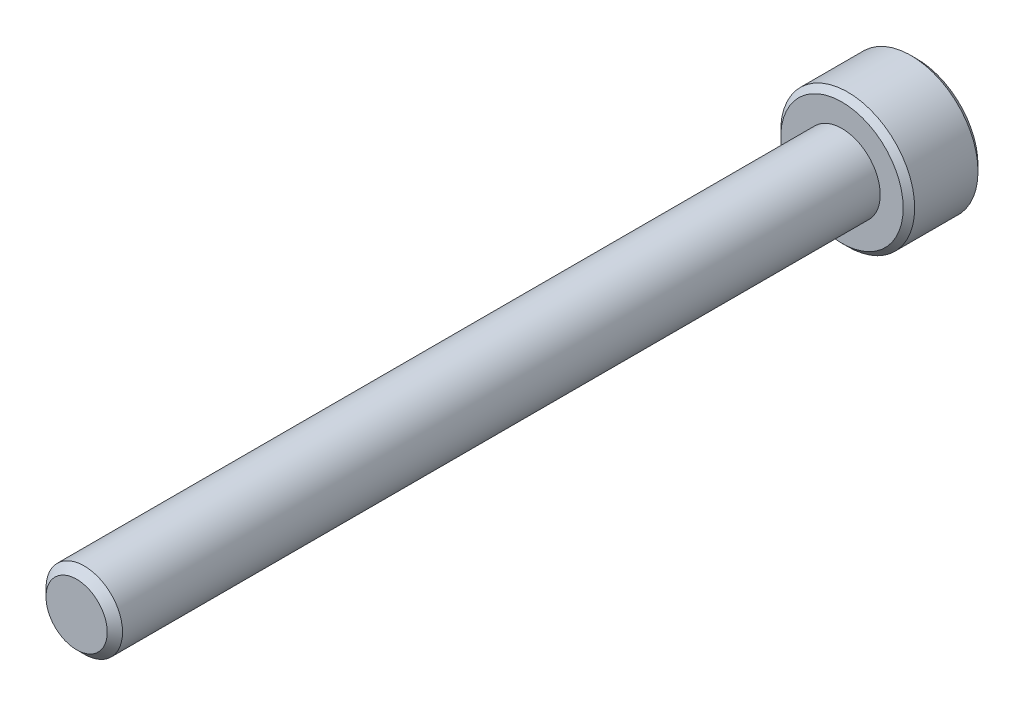
ISO-10303-21;
HEADER;
FILE_DESCRIPTION(('STEP AP214'),'2;1');
FILE_NAME('part.step','',(''),(''),'','','');
FILE_SCHEMA(('AUTOMOTIVE_DESIGN { 1 0 10303 214 1 1 1 1 }'));
ENDSEC;
DATA;
#1=APPLICATION_CONTEXT('core data for automotive mechanical design processes');
#2=APPLICATION_PROTOCOL_DEFINITION('international standard','automotive_design',2000,#1);
#3=PRODUCT_CONTEXT('',#1,'mechanical');
#4=PRODUCT('Part','Part','',(#3));
#5=PRODUCT_RELATED_PRODUCT_CATEGORY('part','',(#4));
#6=PRODUCT_DEFINITION_FORMATION('','',#4);
#7=PRODUCT_DEFINITION_CONTEXT('part definition',#1,'design');
#8=PRODUCT_DEFINITION('design','',#6,#7);
#9=PRODUCT_DEFINITION_SHAPE('','',#8);
#10=(LENGTH_UNIT() NAMED_UNIT(*) SI_UNIT(.MILLI.,.METRE.));
#11=(NAMED_UNIT(*) PLANE_ANGLE_UNIT() SI_UNIT($,.RADIAN.));
#12=(NAMED_UNIT(*) SI_UNIT($,.STERADIAN.) SOLID_ANGLE_UNIT());
#13=UNCERTAINTY_MEASURE_WITH_UNIT(LENGTH_MEASURE(1.E-05),#10,'distance_accuracy_value','');
#14=(GEOMETRIC_REPRESENTATION_CONTEXT(3) GLOBAL_UNCERTAINTY_ASSIGNED_CONTEXT((#13)) GLOBAL_UNIT_ASSIGNED_CONTEXT((#10,
#11,#12)) REPRESENTATION_CONTEXT('',''));
#15=CARTESIAN_POINT('',(0.,0.,0.));
#16=DIRECTION('',(0.,0.,1.));
#17=DIRECTION('',(1.,0.,0.));
#18=AXIS2_PLACEMENT_3D('',#15,#16,#17);
#19=CARTESIAN_POINT('',(0.,0.,3.91));
#20=DIRECTION('',(0.,0.,-1.));
#21=DIRECTION('',(-1.,0.,0.));
#22=AXIS2_PLACEMENT_3D('',#19,#20,#21);
#23=CYLINDRICAL_SURFACE('',#22,3.5);
#24=CARTESIAN_POINT('',(0.,0.,3.60999999999999));
#25=DIRECTION('',(0.,0.,1.));
#26=DIRECTION('',(1.,0.,0.));
#27=AXIS2_PLACEMENT_3D('',#24,#25,#26);
#28=CIRCLE('',#27,3.5);
#29=CARTESIAN_POINT('',(3.5,0.,3.60999999999999));
#30=VERTEX_POINT('',#29);
#31=EDGE_CURVE('E51',#30,#30,#28,.F.);
#32=ORIENTED_EDGE('',*,*,#31,.T.);
#33=EDGE_LOOP('',(#32));
#34=FACE_BOUND('',#33,.T.);
#35=CARTESIAN_POINT('',(0.,0.,0.300000000000001));
#36=DIRECTION('',(0.,0.,1.));
#37=DIRECTION('',(1.,0.,0.));
#38=AXIS2_PLACEMENT_3D('',#35,#36,#37);
#39=CIRCLE('',#38,3.5);
#40=CARTESIAN_POINT('',(3.5,0.,0.300000000000001));
#41=VERTEX_POINT('',#40);
#42=EDGE_CURVE('E182',#41,#41,#39,.T.);
#43=ORIENTED_EDGE('',*,*,#42,.T.);
#44=EDGE_LOOP('',(#43));
#45=FACE_BOUND('',#44,.T.);
#46=ADVANCED_FACE('F41',(#34,#45),#23,.T.);
#47=CARTESIAN_POINT('',(0.,0.,3.91));
#48=DIRECTION('',(0.,0.,1.));
#49=DIRECTION('',(1.,0.,0.));
#50=AXIS2_PLACEMENT_3D('',#47,#48,#49);
#51=PLANE('',#50);
#52=CARTESIAN_POINT('',(0.,0.,3.91));
#53=DIRECTION('',(0.,0.,1.));
#54=DIRECTION('',(1.,0.,0.));
#55=AXIS2_PLACEMENT_3D('',#52,#53,#54);
#56=CIRCLE('',#55,3.19999999999999);
#57=CARTESIAN_POINT('',(3.19999999999999,0.,3.91));
#58=VERTEX_POINT('',#57);
#59=EDGE_CURVE('E178',#58,#58,#56,.T.);
#60=ORIENTED_EDGE('',*,*,#59,.T.);
#61=EDGE_LOOP('',(#60));
#62=FACE_BOUND('',#61,.T.);
#63=CARTESIAN_POINT('',(0.,0.,3.91));
#64=DIRECTION('',(0.,0.,1.));
#65=DIRECTION('',(1.,0.,0.));
#66=AXIS2_PLACEMENT_3D('',#63,#64,#65);
#67=CIRCLE('',#66,2.);
#68=CARTESIAN_POINT('',(2.,0.,3.91));
#69=VERTEX_POINT('',#68);
#70=EDGE_CURVE('E157',#69,#69,#67,.T.);
#71=ORIENTED_EDGE('',*,*,#70,.F.);
#72=EDGE_LOOP('',(#71));
#73=FACE_BOUND('',#72,.T.);
#74=ADVANCED_FACE('F197',(#62,#73),#51,.T.);
#75=CARTESIAN_POINT('',(0.,0.,0.));
#76=DIRECTION('',(0.,0.,1.));
#77=DIRECTION('',(1.,0.,0.));
#78=AXIS2_PLACEMENT_3D('',#75,#76,#77);
#79=PLANE('',#78);
#80=CARTESIAN_POINT('',(0.,0.,0.));
#81=DIRECTION('',(0.,0.,1.));
#82=DIRECTION('',(1.,0.,0.));
#83=AXIS2_PLACEMENT_3D('',#80,#81,#82);
#84=CIRCLE('',#83,3.2);
#85=CARTESIAN_POINT('',(3.2,0.,0.));
#86=VERTEX_POINT('',#85);
#87=EDGE_CURVE('E11',#86,#86,#84,.F.);
#88=ORIENTED_EDGE('',*,*,#87,.T.);
#89=EDGE_LOOP('',(#88));
#90=FACE_BOUND('',#89,.T.);
#91=DIRECTION('',(0.866025403784439,-0.5,0.));
#92=VECTOR('',#91,1.);
#93=CARTESIAN_POINT('',(0.,1.76091832102836,0.));
#94=LINE('',#93,#92);
#95=CARTESIAN_POINT('',(0.,1.76091832102836,0.));
#96=VERTEX_POINT('',#95);
#97=CARTESIAN_POINT('',(1.525,0.88045916051418,0.));
#98=VERTEX_POINT('',#97);
#99=EDGE_CURVE('E138',#96,#98,#94,.T.);
#100=ORIENTED_EDGE('',*,*,#99,.F.);
#101=DIRECTION('',(0.866025403784439,0.5,0.));
#102=VECTOR('',#101,1.);
#103=CARTESIAN_POINT('',(-1.525,0.880459160514179,0.));
#104=LINE('',#103,#102);
#105=CARTESIAN_POINT('',(-1.525,0.880459160514179,0.));
#106=VERTEX_POINT('',#105);
#107=EDGE_CURVE('E58',#106,#96,#104,.T.);
#108=ORIENTED_EDGE('',*,*,#107,.F.);
#109=DIRECTION('',(0.,1.,0.));
#110=VECTOR('',#109,1.);
#111=CARTESIAN_POINT('',(-1.525,-0.88045916051418,0.));
#112=LINE('',#111,#110);
#113=CARTESIAN_POINT('',(-1.525,-0.88045916051418,0.));
#114=VERTEX_POINT('',#113);
#115=EDGE_CURVE('E151',#114,#106,#112,.T.);
#116=ORIENTED_EDGE('',*,*,#115,.F.);
#117=DIRECTION('',(-0.866025403784439,0.5,0.));
#118=VECTOR('',#117,1.);
#119=CARTESIAN_POINT('',(0.,-1.76091832102836,0.));
#120=LINE('',#119,#118);
#121=CARTESIAN_POINT('',(0.,-1.76091832102836,0.));
#122=VERTEX_POINT('',#121);
#123=EDGE_CURVE('E148',#122,#114,#120,.T.);
#124=ORIENTED_EDGE('',*,*,#123,.F.);
#125=DIRECTION('',(-0.866025403784438,-0.5,0.));
#126=VECTOR('',#125,1.);
#127=CARTESIAN_POINT('',(1.525,-0.880459160514179,0.));
#128=LINE('',#127,#126);
#129=CARTESIAN_POINT('',(1.525,-0.880459160514179,0.));
#130=VERTEX_POINT('',#129);
#131=EDGE_CURVE('E106',#130,#122,#128,.T.);
#132=ORIENTED_EDGE('',*,*,#131,.F.);
#133=DIRECTION('',(0.,-1.,0.));
#134=VECTOR('',#133,1.);
#135=CARTESIAN_POINT('',(1.525,0.88045916051418,0.));
#136=LINE('',#135,#134);
#137=EDGE_CURVE('E142',#98,#130,#136,.T.);
#138=ORIENTED_EDGE('',*,*,#137,.F.);
#139=EDGE_LOOP('',(#100,#108,#116,#124,#132,#138));
#140=FACE_BOUND('',#139,.T.);
#141=ADVANCED_FACE('F200',(#90,#140),#79,.F.);
#142=CARTESIAN_POINT('',(0.,0.,43.91));
#143=DIRECTION('',(0.,0.,-1.));
#144=DIRECTION('',(-1.,0.,0.));
#145=AXIS2_PLACEMENT_3D('',#142,#143,#144);
#146=CYLINDRICAL_SURFACE('',#145,2.);
#147=CARTESIAN_POINT('',(0.,0.,43.51));
#148=DIRECTION('',(0.,0.,1.));
#149=DIRECTION('',(1.,0.,0.));
#150=AXIS2_PLACEMENT_3D('',#147,#148,#149);
#151=CIRCLE('',#150,2.);
#152=CARTESIAN_POINT('',(2.,0.,43.51));
#153=VERTEX_POINT('',#152);
#154=EDGE_CURVE('E174',#153,#153,#151,.F.);
#155=ORIENTED_EDGE('',*,*,#154,.T.);
#156=EDGE_LOOP('',(#155));
#157=FACE_BOUND('',#156,.T.);
#158=ORIENTED_EDGE('',*,*,#70,.T.);
#159=EDGE_LOOP('',(#158));
#160=FACE_BOUND('',#159,.T.);
#161=ADVANCED_FACE('F204',(#157,#160),#146,.T.);
#162=CARTESIAN_POINT('',(0.,0.,43.91));
#163=DIRECTION('',(0.,0.,1.));
#164=DIRECTION('',(1.,0.,0.));
#165=AXIS2_PLACEMENT_3D('',#162,#163,#164);
#166=PLANE('',#165);
#167=CARTESIAN_POINT('',(0.,0.,43.91));
#168=DIRECTION('',(0.,0.,1.));
#169=DIRECTION('',(1.,0.,0.));
#170=AXIS2_PLACEMENT_3D('',#167,#168,#169);
#171=CIRCLE('',#170,1.6);
#172=CARTESIAN_POINT('',(1.6,0.,43.91));
#173=VERTEX_POINT('',#172);
#174=EDGE_CURVE('E170',#173,#173,#171,.T.);
#175=ORIENTED_EDGE('',*,*,#174,.T.);
#176=EDGE_LOOP('',(#175));
#177=FACE_BOUND('',#176,.T.);
#178=ADVANCED_FACE('F206',(#177),#166,.T.);
#179=CARTESIAN_POINT('',(-1.525,0.880459160514179,2.));
#180=DIRECTION('',(-0.5,0.866025403784439,0.));
#181=DIRECTION('',(-0.866025403784439,-0.5,0.));
#182=AXIS2_PLACEMENT_3D('',#179,#180,#181);
#183=PLANE('',#182);
#184=ORIENTED_EDGE('',*,*,#107,.T.);
#185=DIRECTION('',(0.,0.,-1.));
#186=VECTOR('',#185,1.);
#187=CARTESIAN_POINT('',(0.,1.76091832102836,2.));
#188=LINE('',#187,#186);
#189=CARTESIAN_POINT('',(0.,1.76091832102836,2.));
#190=VERTEX_POINT('',#189);
#191=EDGE_CURVE('E88',#190,#96,#188,.T.);
#192=ORIENTED_EDGE('',*,*,#191,.F.);
#193=DIRECTION('',(0.866025403784439,0.5,0.));
#194=VECTOR('',#193,1.);
#195=CARTESIAN_POINT('',(-1.525,0.880459160514179,2.));
#196=LINE('',#195,#194);
#197=CARTESIAN_POINT('',(-1.525,0.880459160514179,2.));
#198=VERTEX_POINT('',#197);
#199=EDGE_CURVE('E154',#198,#190,#196,.T.);
#200=ORIENTED_EDGE('',*,*,#199,.F.);
#201=DIRECTION('',(0.,0.,-1.));
#202=VECTOR('',#201,1.);
#203=CARTESIAN_POINT('',(-1.525,0.880459160514179,2.));
#204=LINE('',#203,#202);
#205=EDGE_CURVE('E66',#198,#106,#204,.T.);
#206=ORIENTED_EDGE('',*,*,#205,.T.);
#207=EDGE_LOOP('',(#184,#192,#200,#206));
#208=FACE_BOUND('',#207,.T.);
#209=ADVANCED_FACE('F213',(#208),#183,.F.);
#210=CARTESIAN_POINT('',(-1.525,-0.88045916051418,2.));
#211=DIRECTION('',(-1.,0.,0.));
#212=DIRECTION('',(0.,0.,1.));
#213=AXIS2_PLACEMENT_3D('',#210,#211,#212);
#214=PLANE('',#213);
#215=ORIENTED_EDGE('',*,*,#115,.T.);
#216=ORIENTED_EDGE('',*,*,#205,.F.);
#217=DIRECTION('',(0.,1.,0.));
#218=VECTOR('',#217,1.);
#219=CARTESIAN_POINT('',(-1.525,-0.88045916051418,2.));
#220=LINE('',#219,#218);
#221=CARTESIAN_POINT('',(-1.525,-0.88045916051418,2.));
#222=VERTEX_POINT('',#221);
#223=EDGE_CURVE('E120',#222,#198,#220,.T.);
#224=ORIENTED_EDGE('',*,*,#223,.F.);
#225=DIRECTION('',(0.,0.,-1.));
#226=VECTOR('',#225,1.);
#227=CARTESIAN_POINT('',(-1.525,-0.88045916051418,2.));
#228=LINE('',#227,#226);
#229=EDGE_CURVE('E111',#222,#114,#228,.T.);
#230=ORIENTED_EDGE('',*,*,#229,.T.);
#231=EDGE_LOOP('',(#215,#216,#224,#230));
#232=FACE_BOUND('',#231,.T.);
#233=ADVANCED_FACE('F248',(#232),#214,.F.);
#234=CARTESIAN_POINT('',(0.,-1.76091832102836,2.));
#235=DIRECTION('',(-0.5,-0.866025403784439,0.));
#236=DIRECTION('',(0.866025403784439,-0.5,0.));
#237=AXIS2_PLACEMENT_3D('',#234,#235,#236);
#238=PLANE('',#237);
#239=ORIENTED_EDGE('',*,*,#123,.T.);
#240=ORIENTED_EDGE('',*,*,#229,.F.);
#241=DIRECTION('',(-0.866025403784439,0.5,0.));
#242=VECTOR('',#241,1.);
#243=CARTESIAN_POINT('',(0.,-1.76091832102836,2.));
#244=LINE('',#243,#242);
#245=CARTESIAN_POINT('',(0.,-1.76091832102836,2.));
#246=VERTEX_POINT('',#245);
#247=EDGE_CURVE('E115',#246,#222,#244,.T.);
#248=ORIENTED_EDGE('',*,*,#247,.F.);
#249=DIRECTION('',(0.,0.,-1.));
#250=VECTOR('',#249,1.);
#251=CARTESIAN_POINT('',(0.,-1.76091832102836,2.));
#252=LINE('',#251,#250);
#253=EDGE_CURVE('E99',#246,#122,#252,.T.);
#254=ORIENTED_EDGE('',*,*,#253,.T.);
#255=EDGE_LOOP('',(#239,#240,#248,#254));
#256=FACE_BOUND('',#255,.T.);
#257=ADVANCED_FACE('F116',(#256),#238,.F.);
#258=CARTESIAN_POINT('',(1.525,-0.880459160514179,2.));
#259=DIRECTION('',(0.5,-0.866025403784439,0.));
#260=DIRECTION('',(0.866025403784438,0.5,0.));
#261=AXIS2_PLACEMENT_3D('',#258,#259,#260);
#262=PLANE('',#261);
#263=ORIENTED_EDGE('',*,*,#131,.T.);
#264=ORIENTED_EDGE('',*,*,#253,.F.);
#265=DIRECTION('',(-0.866025403784438,-0.5,0.));
#266=VECTOR('',#265,1.);
#267=CARTESIAN_POINT('',(1.525,-0.880459160514179,2.));
#268=LINE('',#267,#266);
#269=CARTESIAN_POINT('',(1.525,-0.880459160514179,2.));
#270=VERTEX_POINT('',#269);
#271=EDGE_CURVE('E103',#270,#246,#268,.T.);
#272=ORIENTED_EDGE('',*,*,#271,.F.);
#273=DIRECTION('',(0.,0.,-1.));
#274=VECTOR('',#273,1.);
#275=CARTESIAN_POINT('',(1.525,-0.880459160514179,2.));
#276=LINE('',#275,#274);
#277=EDGE_CURVE('E112',#270,#130,#276,.T.);
#278=ORIENTED_EDGE('',*,*,#277,.T.);
#279=EDGE_LOOP('',(#263,#264,#272,#278));
#280=FACE_BOUND('',#279,.T.);
#281=ADVANCED_FACE('F101',(#280),#262,.F.);
#282=CARTESIAN_POINT('',(1.525,0.88045916051418,2.));
#283=DIRECTION('',(1.,0.,0.));
#284=DIRECTION('',(0.,0.,-1.));
#285=AXIS2_PLACEMENT_3D('',#282,#283,#284);
#286=PLANE('',#285);
#287=ORIENTED_EDGE('',*,*,#137,.T.);
#288=ORIENTED_EDGE('',*,*,#277,.F.);
#289=DIRECTION('',(0.,-1.,0.));
#290=VECTOR('',#289,1.);
#291=CARTESIAN_POINT('',(1.525,0.88045916051418,2.));
#292=LINE('',#291,#290);
#293=CARTESIAN_POINT('',(1.525,0.88045916051418,2.));
#294=VERTEX_POINT('',#293);
#295=EDGE_CURVE('E126',#294,#270,#292,.T.);
#296=ORIENTED_EDGE('',*,*,#295,.F.);
#297=DIRECTION('',(0.,0.,-1.));
#298=VECTOR('',#297,1.);
#299=CARTESIAN_POINT('',(1.525,0.88045916051418,2.));
#300=LINE('',#299,#298);
#301=EDGE_CURVE('E162',#294,#98,#300,.T.);
#302=ORIENTED_EDGE('',*,*,#301,.T.);
#303=EDGE_LOOP('',(#287,#288,#296,#302));
#304=FACE_BOUND('',#303,.T.);
#305=ADVANCED_FACE('F244',(#304),#286,.F.);
#306=CARTESIAN_POINT('',(0.,1.76091832102836,2.));
#307=DIRECTION('',(0.5,0.866025403784439,0.));
#308=DIRECTION('',(-0.866025403784439,0.5,0.));
#309=AXIS2_PLACEMENT_3D('',#306,#307,#308);
#310=PLANE('',#309);
#311=ORIENTED_EDGE('',*,*,#99,.T.);
#312=ORIENTED_EDGE('',*,*,#301,.F.);
#313=DIRECTION('',(0.866025403784439,-0.5,0.));
#314=VECTOR('',#313,1.);
#315=CARTESIAN_POINT('',(0.,1.76091832102836,2.));
#316=LINE('',#315,#314);
#317=EDGE_CURVE('E130',#190,#294,#316,.T.);
#318=ORIENTED_EDGE('',*,*,#317,.F.);
#319=ORIENTED_EDGE('',*,*,#191,.T.);
#320=EDGE_LOOP('',(#311,#312,#318,#319));
#321=FACE_BOUND('',#320,.T.);
#322=ADVANCED_FACE('F236',(#321),#310,.F.);
#323=CARTESIAN_POINT('',(0.,0.,2.));
#324=DIRECTION('',(0.,0.,-1.));
#325=DIRECTION('',(-1.,0.,0.));
#326=AXIS2_PLACEMENT_3D('',#323,#324,#325);
#327=PLANE('',#326);
#328=ORIENTED_EDGE('',*,*,#199,.T.);
#329=ORIENTED_EDGE('',*,*,#317,.T.);
#330=ORIENTED_EDGE('',*,*,#295,.T.);
#331=ORIENTED_EDGE('',*,*,#271,.T.);
#332=ORIENTED_EDGE('',*,*,#247,.T.);
#333=ORIENTED_EDGE('',*,*,#223,.T.);
#334=EDGE_LOOP('',(#328,#329,#330,#331,#332,#333));
#335=FACE_BOUND('',#334,.T.);
#336=ADVANCED_FACE('F123',(#335),#327,.T.);
#337=CARTESIAN_POINT('',(0.,0.,43.91));
#338=DIRECTION('',(0.,0.,-1.));
#339=DIRECTION('',(-1.,0.,0.));
#340=AXIS2_PLACEMENT_3D('',#337,#338,#339);
#341=CONICAL_SURFACE('',#340,1.6,0.785398163397438);
#342=ORIENTED_EDGE('',*,*,#154,.F.);
#343=EDGE_LOOP('',(#342));
#344=FACE_BOUND('',#343,.T.);
#345=ORIENTED_EDGE('',*,*,#174,.F.);
#346=EDGE_LOOP('',(#345));
#347=FACE_BOUND('',#346,.T.);
#348=ADVANCED_FACE('F194',(#344,#347),#341,.T.);
#349=CARTESIAN_POINT('',(0.,0.,3.91));
#350=DIRECTION('',(0.,0.,-1.));
#351=DIRECTION('',(-1.,0.,0.));
#352=AXIS2_PLACEMENT_3D('',#349,#350,#351);
#353=CONICAL_SURFACE('',#352,3.19999999999999,0.785398163397447);
#354=ORIENTED_EDGE('',*,*,#31,.F.);
#355=EDGE_LOOP('',(#354));
#356=FACE_BOUND('',#355,.T.);
#357=ORIENTED_EDGE('',*,*,#59,.F.);
#358=EDGE_LOOP('',(#357));
#359=FACE_BOUND('',#358,.T.);
#360=ADVANCED_FACE('F191',(#356,#359),#353,.T.);
#361=CARTESIAN_POINT('',(0.,0.,0.300000000000001));
#362=DIRECTION('',(0.,0.,1.));
#363=DIRECTION('',(1.,0.,0.));
#364=AXIS2_PLACEMENT_3D('',#361,#362,#363);
#365=CONICAL_SURFACE('',#364,3.5,0.785398163397451);
#366=CARTESIAN_POINT('',(3.2,0.,0.));
#367=CARTESIAN_POINT('',(3.203125,0.,0.00312500000000003));
#368=CARTESIAN_POINT('',(3.20625,0.,0.00625000000000004));
#369=CARTESIAN_POINT('',(3.2125,0.,0.0125));
#370=CARTESIAN_POINT('',(3.215625,0.,0.015625));
#371=CARTESIAN_POINT('',(3.221875,0.,0.021875));
#372=CARTESIAN_POINT('',(3.225,0.,0.025));
#373=CARTESIAN_POINT('',(3.23125,0.,0.03125));
#374=CARTESIAN_POINT('',(3.234375,0.,0.0343750000000001));
#375=CARTESIAN_POINT('',(3.240625,0.,0.0406250000000001));
#376=CARTESIAN_POINT('',(3.24375,0.,0.04375));
#377=CARTESIAN_POINT('',(3.25,0.,0.0500000000000001));
#378=CARTESIAN_POINT('',(3.253125,0.,0.0531250000000001));
#379=CARTESIAN_POINT('',(3.259375,0.,0.0593750000000001));
#380=CARTESIAN_POINT('',(3.2625,0.,0.0625000000000001));
#381=CARTESIAN_POINT('',(3.26875,0.,0.0687500000000001));
#382=CARTESIAN_POINT('',(3.271875,0.,0.0718750000000001));
#383=CARTESIAN_POINT('',(3.278125,0.,0.0781250000000002));
#384=CARTESIAN_POINT('',(3.28125,0.,0.0812500000000002));
#385=CARTESIAN_POINT('',(3.2875,0.,0.0875000000000001));
#386=CARTESIAN_POINT('',(3.290625,0.,0.0906250000000001));
#387=CARTESIAN_POINT('',(3.296875,0.,0.0968750000000002));
#388=CARTESIAN_POINT('',(3.3,0.,0.1));
#389=CARTESIAN_POINT('',(3.30625,0.,0.10625));
#390=CARTESIAN_POINT('',(3.309375,0.,0.109375));
#391=CARTESIAN_POINT('',(3.315625,0.,0.115625));
#392=CARTESIAN_POINT('',(3.31875,0.,0.11875));
#393=CARTESIAN_POINT('',(3.325,0.,0.125));
#394=CARTESIAN_POINT('',(3.328125,0.,0.128125));
#395=CARTESIAN_POINT('',(3.334375,0.,0.134375));
#396=CARTESIAN_POINT('',(3.3375,0.,0.1375));
#397=CARTESIAN_POINT('',(3.34375,0.,0.14375));
#398=CARTESIAN_POINT('',(3.346875,0.,0.146875));
#399=CARTESIAN_POINT('',(3.353125,0.,0.153125));
#400=CARTESIAN_POINT('',(3.35625,0.,0.15625));
#401=CARTESIAN_POINT('',(3.3625,0.,0.1625));
#402=CARTESIAN_POINT('',(3.365625,0.,0.165625));
#403=CARTESIAN_POINT('',(3.371875,0.,0.171875));
#404=CARTESIAN_POINT('',(3.375,0.,0.175));
#405=CARTESIAN_POINT('',(3.38125,0.,0.18125));
#406=CARTESIAN_POINT('',(3.384375,0.,0.184375));
#407=CARTESIAN_POINT('',(3.390625,0.,0.190625));
#408=CARTESIAN_POINT('',(3.39375,0.,0.19375));
#409=CARTESIAN_POINT('',(3.4,0.,0.2));
#410=CARTESIAN_POINT('',(3.403125,0.,0.203125));
#411=CARTESIAN_POINT('',(3.409375,0.,0.209375000000001));
#412=CARTESIAN_POINT('',(3.4125,0.,0.2125));
#413=CARTESIAN_POINT('',(3.41875,0.,0.21875));
#414=CARTESIAN_POINT('',(3.421875,0.,0.221875000000001));
#415=CARTESIAN_POINT('',(3.428125,0.,0.228125000000001));
#416=CARTESIAN_POINT('',(3.43125,0.,0.231250000000001));
#417=CARTESIAN_POINT('',(3.4375,0.,0.237500000000001));
#418=CARTESIAN_POINT('',(3.440625,0.,0.240625000000001));
#419=CARTESIAN_POINT('',(3.446875,0.,0.246875000000001));
#420=CARTESIAN_POINT('',(3.45,0.,0.250000000000001));
#421=CARTESIAN_POINT('',(3.45625,0.,0.256250000000001));
#422=CARTESIAN_POINT('',(3.459375,0.,0.259375000000001));
#423=CARTESIAN_POINT('',(3.465625,0.,0.265625000000001));
#424=CARTESIAN_POINT('',(3.46875,0.,0.268750000000001));
#425=CARTESIAN_POINT('',(3.475,0.,0.275000000000001));
#426=CARTESIAN_POINT('',(3.478125,0.,0.278125000000001));
#427=CARTESIAN_POINT('',(3.484375,0.,0.284375000000001));
#428=CARTESIAN_POINT('',(3.4875,0.,0.287500000000001));
#429=CARTESIAN_POINT('',(3.49375,0.,0.293750000000001));
#430=CARTESIAN_POINT('',(3.496875,0.,0.296875000000001));
#431=CARTESIAN_POINT('',(3.5,0.,0.300000000000001));
#432=B_SPLINE_CURVE_WITH_KNOTS('',3,(#366,#367,#368,#369,#370,#371,#372,#373,#374,#375,#376,
#377,#378,#379,#380,#381,#382,#383,#384,#385,#386,#387,#388,#389,#390,#391,#392,#393,#394,#395,
#396,#397,#398,#399,#400,#401,#402,#403,#404,#405,#406,#407,#408,#409,#410,#411,#412,#413,#414,
#415,#416,#417,#418,#419,#420,#421,#422,#423,#424,#425,#426,#427,#428,#429,#430,#431),
.UNSPECIFIED.,.F.,.F.,(4,2,2,2,2,2,2,2,2,2,2,2,2,2,2,2,2,2,2,2,2,2,2,2,2,2,2,2,2,2,2,2,4),(0.,
0.0132582521472477,0.0265165042944956,0.0397747564417436,0.0530330085889913,0.0662912607362393,
0.0795495128834869,0.0928077650307349,0.106066017177983,0.119324269325231,0.132582521472478,
0.145840773619726,0.159099025766974,0.172357277914222,0.18561553006147,0.198873782208717,
0.212132034355965,0.225390286503213,0.238648538650461,0.251906790797709,0.265165042944957,
0.278423295092205,0.291681547239452,0.3049397993867,0.318198051533948,0.331456303681196,
0.344714555828444,0.357972807975692,0.37123106012294,0.384489312270187,0.397747564417435,
0.411005816564683,0.424264068711931),.UNSPECIFIED.);
#433=EDGE_CURVE('BSEAM44',#86,#41,#432,.T.);
#434=ORIENTED_EDGE('',*,*,#87,.F.);
#435=ORIENTED_EDGE('',*,*,#42,.F.);
#436=ORIENTED_EDGE('',*,*,#433,.T.);
#437=ORIENTED_EDGE('',*,*,#433,.F.);
#438=EDGE_LOOP('',(#434,#436,#435,#437));
#439=FACE_BOUND('',#438,.T.);
#440=ADVANCED_FACE('F44',(#439),#365,.T.);
#441=CLOSED_SHELL('',(#46,#74,#141,#161,#178,#209,#233,#257,#281,#305,#322,#336,#348,#360,#440));
#442=MANIFOLD_SOLID_BREP('B2',#441);
#443=ADVANCED_BREP_SHAPE_REPRESENTATION('',(#18,#442),#14);
#444=SHAPE_DEFINITION_REPRESENTATION(#9,#443);
ENDSEC;
END-ISO-10303-21;
